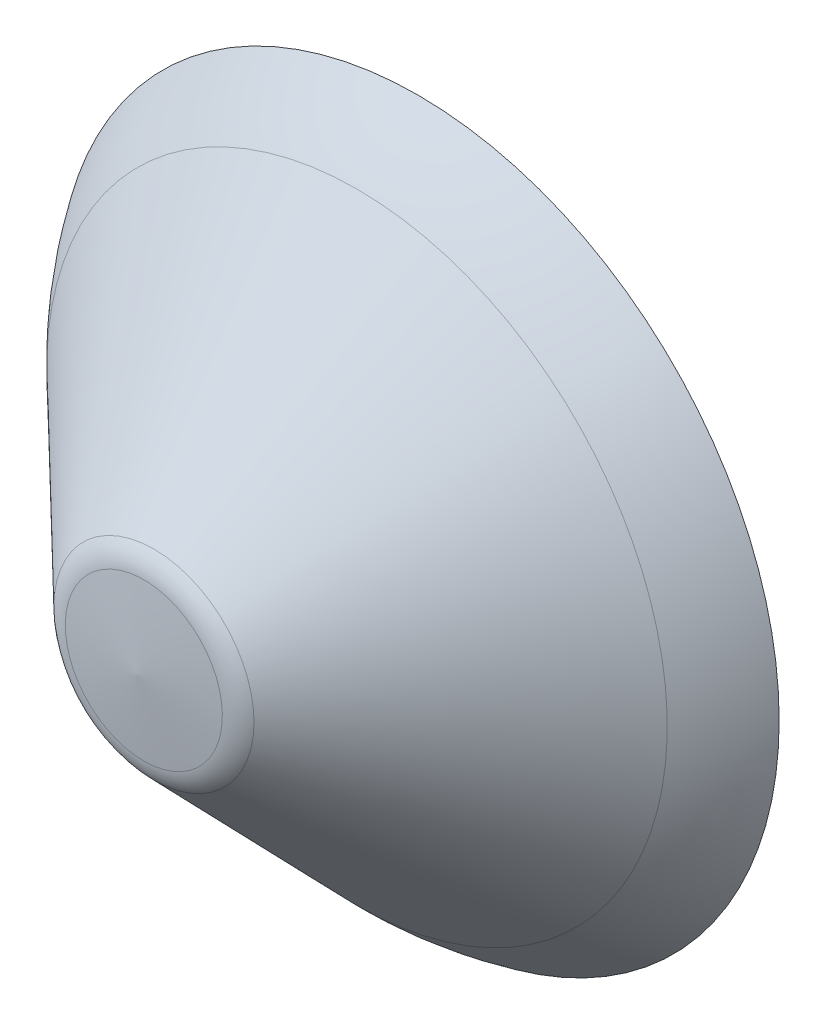
ISO-10303-21;
HEADER;
FILE_DESCRIPTION(('STEP AP214'),'2;1');
FILE_NAME('part.step','',(''),(''),'','','');
FILE_SCHEMA(('AUTOMOTIVE_DESIGN { 1 0 10303 214 1 1 1 1 }'));
ENDSEC;
DATA;
#1=APPLICATION_CONTEXT('core data for automotive mechanical design processes');
#2=APPLICATION_PROTOCOL_DEFINITION('international standard','automotive_design',2000,#1);
#3=PRODUCT_CONTEXT('',#1,'mechanical');
#4=PRODUCT('Part','Part','',(#3));
#5=PRODUCT_RELATED_PRODUCT_CATEGORY('part','',(#4));
#6=PRODUCT_DEFINITION_FORMATION('','',#4);
#7=PRODUCT_DEFINITION_CONTEXT('part definition',#1,'design');
#8=PRODUCT_DEFINITION('design','',#6,#7);
#9=PRODUCT_DEFINITION_SHAPE('','',#8);
#10=(LENGTH_UNIT() NAMED_UNIT(*) SI_UNIT(.MILLI.,.METRE.));
#11=(NAMED_UNIT(*) PLANE_ANGLE_UNIT() SI_UNIT($,.RADIAN.));
#12=(NAMED_UNIT(*) SI_UNIT($,.STERADIAN.) SOLID_ANGLE_UNIT());
#13=UNCERTAINTY_MEASURE_WITH_UNIT(LENGTH_MEASURE(1.E-05),#10,'distance_accuracy_value','');
#14=(GEOMETRIC_REPRESENTATION_CONTEXT(3) GLOBAL_UNCERTAINTY_ASSIGNED_CONTEXT((#13)) GLOBAL_UNIT_ASSIGNED_CONTEXT((#10,
#11,#12)) REPRESENTATION_CONTEXT('',''));
#15=CARTESIAN_POINT('',(0.,0.,0.));
#16=DIRECTION('',(0.,0.,1.));
#17=DIRECTION('',(1.,0.,0.));
#18=AXIS2_PLACEMENT_3D('',#15,#16,#17);
#19=CARTESIAN_POINT('',(0.,-1.14491749414469E-13,-65.7573998250793));
#20=DIRECTION('',(0.,0.,1.));
#21=DIRECTION('',(0.,-1.,0.));
#22=AXIS2_PLACEMENT_3D('',#19,#20,#21);
#23=DEGENERATE_TOROIDAL_SURFACE('',#22,8.12691313758413,49.25,.T.);
#24=CARTESIAN_POINT('',(0.,0.,-30.3374946085867));
#25=DIRECTION('',(0.,0.,1.));
#26=DIRECTION('',(0.,-1.,0.));
#27=AXIS2_PLACEMENT_3D('',#24,#25,#26);
#28=CIRCLE('',#27,42.3466854111496);
#29=CARTESIAN_POINT('',(0.,42.3466854111496,-30.3374946085867));
#30=VERTEX_POINT('',#29);
#31=EDGE_CURVE('E53',#30,#30,#28,.T.);
#32=ORIENTED_EDGE('',*,*,#31,.F.);
#33=EDGE_LOOP('',(#32));
#34=FACE_BOUND('',#33,.T.);
#35=CARTESIAN_POINT('',(0.,0.,-38.6899464811603));
#36=DIRECTION('',(0.,0.,1.));
#37=DIRECTION('',(0.,-1.,0.));
#38=AXIS2_PLACEMENT_3D('',#35,#36,#37);
#39=CIRCLE('',#38,49.2719671474499);
#40=CARTESIAN_POINT('',(0.,-49.2719671474499,-38.6899464811602));
#41=VERTEX_POINT('',#40);
#42=EDGE_CURVE('E11',#41,#41,#39,.T.);
#43=ORIENTED_EDGE('',*,*,#42,.T.);
#44=EDGE_LOOP('',(#43));
#45=FACE_BOUND('',#44,.T.);
#46=ADVANCED_FACE('F33',(#34,#45),#23,.T.);
#47=CARTESIAN_POINT('',(0.,49.2719671474498,-38.6899464811604));
#48=DIRECTION('',(0.,0.,1.));
#49=DIRECTION('',(0.,-1.,0.));
#50=AXIS2_PLACEMENT_3D('',#47,#48,#49);
#51=PLANE('',#50);
#52=ORIENTED_EDGE('',*,*,#42,.F.);
#53=EDGE_LOOP('',(#52));
#54=FACE_BOUND('',#53,.T.);
#55=ADVANCED_FACE('F46',(#54),#51,.F.);
#56=CARTESIAN_POINT('',(0.,21.2275954087796,-299.540628156384));
#57=DIRECTION('',(-1.,0.,0.));
#58=DIRECTION('',(0.,-1.,0.));
#59=AXIS2_PLACEMENT_3D('',#56,#57,#58);
#60=CIRCLE('',#59,300.);
#61=TRIMMED_CURVE('',#60,(PARAMETER_VALUE(-1.499978496422)),(PARAMETER_VALUE(1.499978496422)),
.T.,.PARAMETER.);
#62=CARTESIAN_POINT('',(0.,-5.20417042793042E-13,-299.540628156384));
#63=DIRECTION('',(0.,0.,1.));
#64=AXIS1_PLACEMENT('',#62,#63);
#65=SURFACE_OF_REVOLUTION('',#61,#64);
#66=CARTESIAN_POINT('',(0.,0.,-0.292588575234953));
#67=VERTEX_POINT('',#66);
#68=VERTEX_LOOP('',#67);
#69=FACE_BOUND('',#68,.T.);
#70=CARTESIAN_POINT('',(0.,0.,-1.24628408098613));
#71=DIRECTION('',(0.,0.,1.));
#72=DIRECTION('',(0.,-1.,0.));
#73=AXIS2_PLACEMENT_3D('',#70,#71,#72);
#74=CIRCLE('',#73,10.717424432006);
#75=CARTESIAN_POINT('',(0.,-10.717424432006,-1.24628408098611));
#76=VERTEX_POINT('',#75);
#77=EDGE_CURVE('E39',#76,#76,#74,.T.);
#78=ORIENTED_EDGE('',*,*,#77,.T.);
#79=EDGE_LOOP('',(#78));
#80=FACE_BOUND('',#79,.T.);
#81=ADVANCED_FACE('F42',(#69,#80),#65,.T.);
#82=CARTESIAN_POINT('',(0.,0.,-6.21785648224239));
#83=DIRECTION('',(0.,0.,1.));
#84=DIRECTION('',(0.,-1.,0.));
#85=AXIS2_PLACEMENT_3D('',#82,#83,#84);
#86=TOROIDAL_SURFACE('',#85,10.1850074346601,5.00000000000002);
#87=ORIENTED_EDGE('',*,*,#77,.F.);
#88=EDGE_LOOP('',(#87));
#89=FACE_BOUND('',#88,.T.);
#90=CARTESIAN_POINT('',(0.,0.,-2.62192701863907));
#91=DIRECTION('',(0.,0.,1.));
#92=DIRECTION('',(0.,-1.,0.));
#93=AXIS2_PLACEMENT_3D('',#90,#91,#92);
#94=CIRCLE('',#93,13.659095990352);
#95=CARTESIAN_POINT('',(0.,13.659095990352,-2.62192701863909));
#96=VERTEX_POINT('',#95);
#97=EDGE_CURVE('E51',#96,#96,#94,.T.);
#98=ORIENTED_EDGE('',*,*,#97,.T.);
#99=EDGE_LOOP('',(#98));
#100=FACE_BOUND('',#99,.T.);
#101=ADVANCED_FACE('F45',(#89,#100),#86,.T.);
#102=CARTESIAN_POINT('',(0.,0.,-30.3374946085867));
#103=DIRECTION('',(0.,0.,-1.));
#104=DIRECTION('',(0.,1.,0.));
#105=AXIS2_PLACEMENT_3D('',#102,#103,#104);
#106=CONICAL_SURFACE('',#105,42.3466854111496,0.802629922607971);
#107=CARTESIAN_POINT('',(0.,13.659095990352,-2.62192701863909));
#108=CARTESIAN_POINT('',(0.,13.9579250468186,-2.91063084770104));
#109=CARTESIAN_POINT('',(0.,14.2567541032853,-3.199334676763));
#110=CARTESIAN_POINT('',(0.,14.8544122162186,-3.77674233488691));
#111=CARTESIAN_POINT('',(0.,15.1532412726852,-4.06544616394886));
#112=CARTESIAN_POINT('',(0.,15.7508993856185,-4.64285382207277));
#113=CARTESIAN_POINT('',(0.,16.0497284420851,-4.93155765113473));
#114=CARTESIAN_POINT('',(0.,16.6473865550184,-5.50896530925864));
#115=CARTESIAN_POINT('',(0.,16.946215611485,-5.79766913832059));
#116=CARTESIAN_POINT('',(0.,17.5438737244183,-6.3750767964445));
#117=CARTESIAN_POINT('',(0.,17.842702780885,-6.66378062550645));
#118=CARTESIAN_POINT('',(0.,18.4403608938183,-7.24118828363036));
#119=CARTESIAN_POINT('',(0.,18.7391899502849,-7.52989211269232));
#120=CARTESIAN_POINT('',(0.,19.3368480632182,-8.10729977081623));
#121=CARTESIAN_POINT('',(0.,19.6356771196848,-8.39600359987819));
#122=CARTESIAN_POINT('',(0.,20.2333352326181,-8.97341125800209));
#123=CARTESIAN_POINT('',(0.,20.5321642890847,-9.26211508706405));
#124=CARTESIAN_POINT('',(0.,21.129822402018,-9.83952274518796));
#125=CARTESIAN_POINT('',(0.,21.4286514584847,-10.1282265742499));
#126=CARTESIAN_POINT('',(0.,22.0263095714179,-10.7056342323738));
#127=CARTESIAN_POINT('',(0.,22.3251386278846,-10.9943380614358));
#128=CARTESIAN_POINT('',(0.,22.9227967408179,-11.5717457195597));
#129=CARTESIAN_POINT('',(0.,23.2216257972845,-11.8604495486216));
#130=CARTESIAN_POINT('',(0.,23.8192839102178,-12.4378572067455));
#131=CARTESIAN_POINT('',(0.,24.1181129666844,-12.7265610358075));
#132=CARTESIAN_POINT('',(0.,24.7157710796177,-13.3039686939314));
#133=CARTESIAN_POINT('',(0.,25.0146001360844,-13.5926725229934));
#134=CARTESIAN_POINT('',(0.,25.6122582490176,-14.1700801811173));
#135=CARTESIAN_POINT('',(0.,25.9110873054843,-14.4587840101792));
#136=CARTESIAN_POINT('',(0.,26.5087454184176,-15.0361916683031));
#137=CARTESIAN_POINT('',(0.,26.8075744748842,-15.3248954973651));
#138=CARTESIAN_POINT('',(0.,27.4052325878175,-15.902303155489));
#139=CARTESIAN_POINT('',(0.,27.7040616442841,-16.191006984551));
#140=CARTESIAN_POINT('',(0.,28.3017197572174,-16.7684146426749));
#141=CARTESIAN_POINT('',(0.,28.6005488136841,-17.0571184717368));
#142=CARTESIAN_POINT('',(0.,29.1982069266173,-17.6345261298607));
#143=CARTESIAN_POINT('',(0.,29.497035983084,-17.9232299589227));
#144=CARTESIAN_POINT('',(0.,30.0946940960173,-18.5006376170466));
#145=CARTESIAN_POINT('',(0.,30.3935231524839,-18.7893414461086));
#146=CARTESIAN_POINT('',(0.,30.9911812654172,-19.3667491042325));
#147=CARTESIAN_POINT('',(0.,31.2900103218838,-19.6554529332944));
#148=CARTESIAN_POINT('',(0.,31.8876684348171,-20.2328605914183));
#149=CARTESIAN_POINT('',(0.,32.1864974912838,-20.5215644204803));
#150=CARTESIAN_POINT('',(0.,32.784155604217,-21.0989720786042));
#151=CARTESIAN_POINT('',(0.,33.0829846606837,-21.3876759076661));
#152=CARTESIAN_POINT('',(0.,33.680642773617,-21.9650835657901));
#153=CARTESIAN_POINT('',(0.,33.9794718300836,-22.253787394852));
#154=CARTESIAN_POINT('',(0.,34.5771299430169,-22.8311950529759));
#155=CARTESIAN_POINT('',(0.,34.8759589994835,-23.1198988820379));
#156=CARTESIAN_POINT('',(0.,35.4736171124168,-23.6973065401618));
#157=CARTESIAN_POINT('',(0.,35.7724461688835,-23.9860103692237));
#158=CARTESIAN_POINT('',(0.,36.3701042818167,-24.5634180273476));
#159=CARTESIAN_POINT('',(0.,36.6689333382834,-24.8521218564096));
#160=CARTESIAN_POINT('',(0.,37.2665914512167,-25.4295295145335));
#161=CARTESIAN_POINT('',(0.,37.5654205076833,-25.7182333435955));
#162=CARTESIAN_POINT('',(0.,38.1630786206166,-26.2956410017194));
#163=CARTESIAN_POINT('',(0.,38.4619076770832,-26.5843448307813));
#164=CARTESIAN_POINT('',(0.,39.0595657900165,-27.1617524889052));
#165=CARTESIAN_POINT('',(0.,39.3583948464832,-27.4504563179672));
#166=CARTESIAN_POINT('',(0.,39.9560529594164,-28.0278639760911));
#167=CARTESIAN_POINT('',(0.,40.2548820158831,-28.3165678051531));
#168=CARTESIAN_POINT('',(0.,40.8525401288164,-28.893975463277));
#169=CARTESIAN_POINT('',(0.,41.151369185283,-29.1826792923389));
#170=CARTESIAN_POINT('',(0.,41.7490272982163,-29.7600869504628));
#171=CARTESIAN_POINT('',(0.,42.0478563546829,-30.0487907795248));
#172=CARTESIAN_POINT('',(0.,42.3466854111496,-30.3374946085867));
#173=B_SPLINE_CURVE_WITH_KNOTS('',3,(#107,#108,#109,#110,#111,#112,#113,#114,#115,#116,#117,
#118,#119,#120,#121,#122,#123,#124,#125,#126,#127,#128,#129,#130,#131,#132,#133,#134,#135,#136,
#137,#138,#139,#140,#141,#142,#143,#144,#145,#146,#147,#148,#149,#150,#151,#152,#153,#154,#155,
#156,#157,#158,#159,#160,#161,#162,#163,#164,#165,#166,#167,#168,#169,#170,#171,#172),
.UNSPECIFIED.,.F.,.F.,(4,2,2,2,2,2,2,2,2,2,2,2,2,2,2,2,2,2,2,2,2,2,2,2,2,2,2,2,2,2,2,2,4),(0.,
1.24653052635465,2.4930610527093,3.73959157906395,4.9861221054186,6.23265263177325,
7.47918315812789,8.72571368448254,9.97224421083719,11.2187747371918,12.4653052635465,
13.7118357899011,14.9583663162558,16.2048968426104,17.4514273689651,18.6979578953197,
19.9444884216744,21.191018948029,22.4375494743837,23.6840800007383,24.930610527093,
26.1771410534476,27.4236715798023,28.6702021061569,29.9167326325116,31.1632631588662,
32.4097936852209,33.6563242115755,34.9028547379302,36.1493852642848,37.3959157906395,
38.6424463169941,39.8889768433488),.UNSPECIFIED.);
#174=EDGE_CURVE('BSEAM59',#96,#30,#173,.T.);
#175=ORIENTED_EDGE('',*,*,#97,.F.);
#176=ORIENTED_EDGE('',*,*,#31,.T.);
#177=ORIENTED_EDGE('',*,*,#174,.T.);
#178=ORIENTED_EDGE('',*,*,#174,.F.);
#179=EDGE_LOOP('',(#175,#177,#176,#178));
#180=FACE_BOUND('',#179,.T.);
#181=ADVANCED_FACE('F59',(#180),#106,.T.);
#182=CLOSED_SHELL('',(#46,#55,#81,#101,#181));
#183=MANIFOLD_SOLID_BREP('B2',#182);
#184=ADVANCED_BREP_SHAPE_REPRESENTATION('',(#18,#183),#14);
#185=SHAPE_DEFINITION_REPRESENTATION(#9,#184);
ENDSEC;
END-ISO-10303-21;
